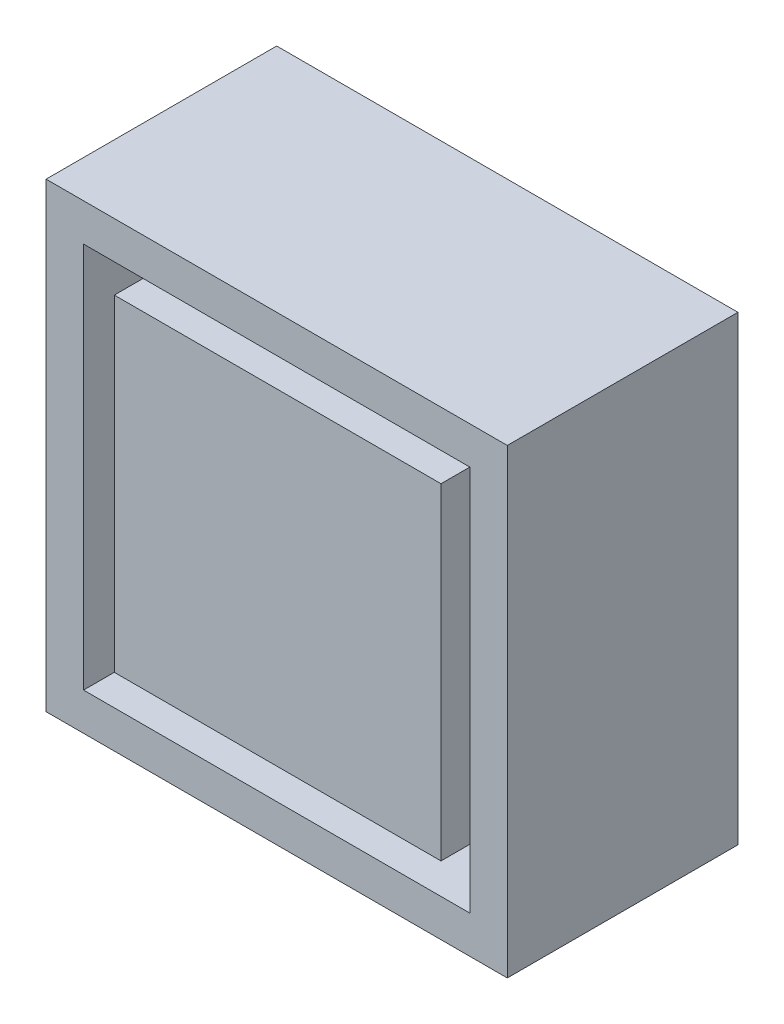
ISO-10303-21;
HEADER;
FILE_DESCRIPTION(('STEP AP214'),'2;1');
FILE_NAME('part.step','',(''),(''),'','','');
FILE_SCHEMA(('AUTOMOTIVE_DESIGN { 1 0 10303 214 1 1 1 1 }'));
ENDSEC;
DATA;
#1=APPLICATION_CONTEXT('core data for automotive mechanical design processes');
#2=APPLICATION_PROTOCOL_DEFINITION('international standard','automotive_design',2000,#1);
#3=PRODUCT_CONTEXT('',#1,'mechanical');
#4=PRODUCT('Part','Part','',(#3));
#5=PRODUCT_RELATED_PRODUCT_CATEGORY('part','',(#4));
#6=PRODUCT_DEFINITION_FORMATION('','',#4);
#7=PRODUCT_DEFINITION_CONTEXT('part definition',#1,'design');
#8=PRODUCT_DEFINITION('design','',#6,#7);
#9=PRODUCT_DEFINITION_SHAPE('','',#8);
#10=(LENGTH_UNIT() NAMED_UNIT(*) SI_UNIT(.MILLI.,.METRE.));
#11=(NAMED_UNIT(*) PLANE_ANGLE_UNIT() SI_UNIT($,.RADIAN.));
#12=(NAMED_UNIT(*) SI_UNIT($,.STERADIAN.) SOLID_ANGLE_UNIT());
#13=UNCERTAINTY_MEASURE_WITH_UNIT(LENGTH_MEASURE(1.E-05),#10,'distance_accuracy_value','');
#14=(GEOMETRIC_REPRESENTATION_CONTEXT(3) GLOBAL_UNCERTAINTY_ASSIGNED_CONTEXT((#13)) GLOBAL_UNIT_ASSIGNED_CONTEXT((#10,
#11,#12)) REPRESENTATION_CONTEXT('',''));
#15=CARTESIAN_POINT('',(0.,0.,0.));
#16=DIRECTION('',(0.,0.,1.));
#17=DIRECTION('',(1.,0.,0.));
#18=AXIS2_PLACEMENT_3D('',#15,#16,#17);
#19=CARTESIAN_POINT('',(0.,0.,1.95));
#20=DIRECTION('',(0.,0.,-1.));
#21=DIRECTION('',(-1.,0.,0.));
#22=AXIS2_PLACEMENT_3D('',#19,#20,#21);
#23=PLANE('',#22);
#24=DIRECTION('',(0.,-1.,0.));
#25=VECTOR('',#24,1.);
#26=CARTESIAN_POINT('',(1.95,0.,1.95));
#27=LINE('',#26,#25);
#28=CARTESIAN_POINT('',(1.95,22.05,1.95));
#29=VERTEX_POINT('',#28);
#30=CARTESIAN_POINT('',(1.95,1.95,1.95));
#31=VERTEX_POINT('',#30);
#32=EDGE_CURVE('E145',#29,#31,#27,.T.);
#33=ORIENTED_EDGE('',*,*,#32,.T.);
#34=DIRECTION('',(1.,0.,0.));
#35=VECTOR('',#34,1.);
#36=CARTESIAN_POINT('',(0.,1.95,1.95));
#37=LINE('',#36,#35);
#38=CARTESIAN_POINT('',(22.05,1.95,1.95));
#39=VERTEX_POINT('',#38);
#40=EDGE_CURVE('E148',#31,#39,#37,.T.);
#41=ORIENTED_EDGE('',*,*,#40,.T.);
#42=DIRECTION('',(0.,1.,0.));
#43=VECTOR('',#42,1.);
#44=CARTESIAN_POINT('',(22.05,0.,1.95));
#45=LINE('',#44,#43);
#46=CARTESIAN_POINT('',(22.05,22.05,1.95));
#47=VERTEX_POINT('',#46);
#48=EDGE_CURVE('E165',#39,#47,#45,.T.);
#49=ORIENTED_EDGE('',*,*,#48,.T.);
#50=DIRECTION('',(-1.,0.,0.));
#51=VECTOR('',#50,1.);
#52=CARTESIAN_POINT('',(0.,22.05,1.95));
#53=LINE('',#52,#51);
#54=EDGE_CURVE('E169',#47,#29,#53,.T.);
#55=ORIENTED_EDGE('',*,*,#54,.T.);
#56=EDGE_LOOP('',(#33,#41,#49,#55));
#57=FACE_BOUND('',#56,.T.);
#58=DIRECTION('',(0.,-1.,0.));
#59=VECTOR('',#58,1.);
#60=CARTESIAN_POINT('',(3.5,20.5,1.95));
#61=LINE('',#60,#59);
#62=CARTESIAN_POINT('',(3.5,20.5,1.95));
#63=VERTEX_POINT('',#62);
#64=CARTESIAN_POINT('',(3.5,3.5,1.95));
#65=VERTEX_POINT('',#64);
#66=EDGE_CURVE('E144',#63,#65,#61,.T.);
#67=ORIENTED_EDGE('',*,*,#66,.F.);
#68=DIRECTION('',(-1.,0.,0.));
#69=VECTOR('',#68,1.);
#70=CARTESIAN_POINT('',(3.5,20.5,1.95));
#71=LINE('',#70,#69);
#72=CARTESIAN_POINT('',(20.5,20.5,1.95));
#73=VERTEX_POINT('',#72);
#74=EDGE_CURVE('E141',#73,#63,#71,.T.);
#75=ORIENTED_EDGE('',*,*,#74,.F.);
#76=DIRECTION('',(0.,1.,0.));
#77=VECTOR('',#76,1.);
#78=CARTESIAN_POINT('',(20.5,20.5,1.95));
#79=LINE('',#78,#77);
#80=CARTESIAN_POINT('',(20.5,3.5,1.95));
#81=VERTEX_POINT('',#80);
#82=EDGE_CURVE('E55',#81,#73,#79,.T.);
#83=ORIENTED_EDGE('',*,*,#82,.F.);
#84=DIRECTION('',(1.,0.,0.));
#85=VECTOR('',#84,1.);
#86=CARTESIAN_POINT('',(3.5,3.5,1.95));
#87=LINE('',#86,#85);
#88=EDGE_CURVE('E50',#65,#81,#87,.T.);
#89=ORIENTED_EDGE('',*,*,#88,.F.);
#90=EDGE_LOOP('',(#67,#75,#83,#89));
#91=FACE_BOUND('',#90,.T.);
#92=ADVANCED_FACE('F35',(#57,#91),#23,.F.);
#93=CARTESIAN_POINT('',(0.,0.,12.));
#94=DIRECTION('',(0.,0.,-1.));
#95=DIRECTION('',(-1.,0.,0.));
#96=AXIS2_PLACEMENT_3D('',#93,#94,#95);
#97=PLANE('',#96);
#98=DIRECTION('',(0.,-1.,0.));
#99=VECTOR('',#98,1.);
#100=CARTESIAN_POINT('',(0.,0.,12.));
#101=LINE('',#100,#99);
#102=CARTESIAN_POINT('',(0.,24.,12.));
#103=VERTEX_POINT('',#102);
#104=CARTESIAN_POINT('',(0.,0.,12.));
#105=VERTEX_POINT('',#104);
#106=EDGE_CURVE('E181',#103,#105,#101,.T.);
#107=ORIENTED_EDGE('',*,*,#106,.T.);
#108=DIRECTION('',(1.,0.,0.));
#109=VECTOR('',#108,1.);
#110=CARTESIAN_POINT('',(0.,0.,12.));
#111=LINE('',#110,#109);
#112=CARTESIAN_POINT('',(24.,0.,12.));
#113=VERTEX_POINT('',#112);
#114=EDGE_CURVE('E184',#105,#113,#111,.T.);
#115=ORIENTED_EDGE('',*,*,#114,.T.);
#116=DIRECTION('',(0.,1.,0.));
#117=VECTOR('',#116,1.);
#118=CARTESIAN_POINT('',(24.,0.,12.));
#119=LINE('',#118,#117);
#120=CARTESIAN_POINT('',(24.,24.,12.));
#121=VERTEX_POINT('',#120);
#122=EDGE_CURVE('E187',#113,#121,#119,.T.);
#123=ORIENTED_EDGE('',*,*,#122,.T.);
#124=DIRECTION('',(-1.,0.,0.));
#125=VECTOR('',#124,1.);
#126=CARTESIAN_POINT('',(0.,24.,12.));
#127=LINE('',#126,#125);
#128=EDGE_CURVE('E189',#121,#103,#127,.T.);
#129=ORIENTED_EDGE('',*,*,#128,.T.);
#130=EDGE_LOOP('',(#107,#115,#123,#129));
#131=FACE_BOUND('',#130,.T.);
#132=DIRECTION('',(0.,-1.,0.));
#133=VECTOR('',#132,1.);
#134=CARTESIAN_POINT('',(1.95,0.,12.));
#135=LINE('',#134,#133);
#136=CARTESIAN_POINT('',(1.95,22.05,12.));
#137=VERTEX_POINT('',#136);
#138=CARTESIAN_POINT('',(1.95,1.95,12.));
#139=VERTEX_POINT('',#138);
#140=EDGE_CURVE('E173',#137,#139,#135,.T.);
#141=ORIENTED_EDGE('',*,*,#140,.F.);
#142=DIRECTION('',(-1.,0.,0.));
#143=VECTOR('',#142,1.);
#144=CARTESIAN_POINT('',(0.,22.05,12.));
#145=LINE('',#144,#143);
#146=CARTESIAN_POINT('',(22.05,22.05,12.));
#147=VERTEX_POINT('',#146);
#148=EDGE_CURVE('E163',#147,#137,#145,.T.);
#149=ORIENTED_EDGE('',*,*,#148,.F.);
#150=DIRECTION('',(0.,1.,0.));
#151=VECTOR('',#150,1.);
#152=CARTESIAN_POINT('',(22.05,0.,12.));
#153=LINE('',#152,#151);
#154=CARTESIAN_POINT('',(22.05,1.95,12.));
#155=VERTEX_POINT('',#154);
#156=EDGE_CURVE('E177',#155,#147,#153,.T.);
#157=ORIENTED_EDGE('',*,*,#156,.F.);
#158=DIRECTION('',(1.,0.,0.));
#159=VECTOR('',#158,1.);
#160=CARTESIAN_POINT('',(0.,1.95,12.));
#161=LINE('',#160,#159);
#162=EDGE_CURVE('E175',#139,#155,#161,.T.);
#163=ORIENTED_EDGE('',*,*,#162,.F.);
#164=EDGE_LOOP('',(#141,#149,#157,#163));
#165=FACE_BOUND('',#164,.T.);
#166=ADVANCED_FACE('F223',(#131,#165),#97,.F.);
#167=CARTESIAN_POINT('',(0.,0.,12.));
#168=DIRECTION('',(1.,0.,0.));
#169=DIRECTION('',(0.,1.,0.));
#170=AXIS2_PLACEMENT_3D('',#167,#168,#169);
#171=PLANE('',#170);
#172=DIRECTION('',(0.,-1.,0.));
#173=VECTOR('',#172,1.);
#174=CARTESIAN_POINT('',(0.,0.,0.));
#175=LINE('',#174,#173);
#176=CARTESIAN_POINT('',(0.,24.,0.));
#177=VERTEX_POINT('',#176);
#178=CARTESIAN_POINT('',(0.,0.,0.));
#179=VERTEX_POINT('',#178);
#180=EDGE_CURVE('E157',#177,#179,#175,.T.);
#181=ORIENTED_EDGE('',*,*,#180,.T.);
#182=DIRECTION('',(0.,0.,-1.));
#183=VECTOR('',#182,1.);
#184=CARTESIAN_POINT('',(0.,0.,12.));
#185=LINE('',#184,#183);
#186=EDGE_CURVE('E11',#105,#179,#185,.T.);
#187=ORIENTED_EDGE('',*,*,#186,.F.);
#188=ORIENTED_EDGE('',*,*,#106,.F.);
#189=DIRECTION('',(0.,0.,-1.));
#190=VECTOR('',#189,1.);
#191=CARTESIAN_POINT('',(0.,24.,12.));
#192=LINE('',#191,#190);
#193=EDGE_CURVE('E191',#103,#177,#192,.T.);
#194=ORIENTED_EDGE('',*,*,#193,.T.);
#195=EDGE_LOOP('',(#181,#187,#188,#194));
#196=FACE_BOUND('',#195,.T.);
#197=ADVANCED_FACE('F37',(#196),#171,.F.);
#198=CARTESIAN_POINT('',(0.,0.,12.));
#199=DIRECTION('',(0.,1.,0.));
#200=DIRECTION('',(0.,0.,1.));
#201=AXIS2_PLACEMENT_3D('',#198,#199,#200);
#202=PLANE('',#201);
#203=DIRECTION('',(1.,0.,0.));
#204=VECTOR('',#203,1.);
#205=CARTESIAN_POINT('',(0.,0.,0.));
#206=LINE('',#205,#204);
#207=CARTESIAN_POINT('',(24.,0.,0.));
#208=VERTEX_POINT('',#207);
#209=EDGE_CURVE('E194',#179,#208,#206,.T.);
#210=ORIENTED_EDGE('',*,*,#209,.T.);
#211=DIRECTION('',(0.,0.,-1.));
#212=VECTOR('',#211,1.);
#213=CARTESIAN_POINT('',(24.,0.,12.));
#214=LINE('',#213,#212);
#215=EDGE_CURVE('E43',#113,#208,#214,.T.);
#216=ORIENTED_EDGE('',*,*,#215,.F.);
#217=ORIENTED_EDGE('',*,*,#114,.F.);
#218=ORIENTED_EDGE('',*,*,#186,.T.);
#219=EDGE_LOOP('',(#210,#216,#217,#218));
#220=FACE_BOUND('',#219,.T.);
#221=ADVANCED_FACE('F225',(#220),#202,.F.);
#222=CARTESIAN_POINT('',(24.,0.,12.));
#223=DIRECTION('',(-1.,0.,0.));
#224=DIRECTION('',(0.,0.,1.));
#225=AXIS2_PLACEMENT_3D('',#222,#223,#224);
#226=PLANE('',#225);
#227=DIRECTION('',(0.,1.,0.));
#228=VECTOR('',#227,1.);
#229=CARTESIAN_POINT('',(24.,0.,0.));
#230=LINE('',#229,#228);
#231=CARTESIAN_POINT('',(24.,24.,0.));
#232=VERTEX_POINT('',#231);
#233=EDGE_CURVE('E196',#208,#232,#230,.T.);
#234=ORIENTED_EDGE('',*,*,#233,.T.);
#235=DIRECTION('',(0.,0.,-1.));
#236=VECTOR('',#235,1.);
#237=CARTESIAN_POINT('',(24.,24.,12.));
#238=LINE('',#237,#236);
#239=EDGE_CURVE('E201',#121,#232,#238,.T.);
#240=ORIENTED_EDGE('',*,*,#239,.F.);
#241=ORIENTED_EDGE('',*,*,#122,.F.);
#242=ORIENTED_EDGE('',*,*,#215,.T.);
#243=EDGE_LOOP('',(#234,#240,#241,#242));
#244=FACE_BOUND('',#243,.T.);
#245=ADVANCED_FACE('F208',(#244),#226,.F.);
#246=CARTESIAN_POINT('',(0.,24.,12.));
#247=DIRECTION('',(0.,-1.,0.));
#248=DIRECTION('',(0.,0.,-1.));
#249=AXIS2_PLACEMENT_3D('',#246,#247,#248);
#250=PLANE('',#249);
#251=DIRECTION('',(-1.,0.,0.));
#252=VECTOR('',#251,1.);
#253=CARTESIAN_POINT('',(0.,24.,0.));
#254=LINE('',#253,#252);
#255=EDGE_CURVE('E185',#232,#177,#254,.T.);
#256=ORIENTED_EDGE('',*,*,#255,.T.);
#257=ORIENTED_EDGE('',*,*,#193,.F.);
#258=ORIENTED_EDGE('',*,*,#128,.F.);
#259=ORIENTED_EDGE('',*,*,#239,.T.);
#260=EDGE_LOOP('',(#256,#257,#258,#259));
#261=FACE_BOUND('',#260,.T.);
#262=ADVANCED_FACE('F217',(#261),#250,.F.);
#263=CARTESIAN_POINT('',(0.,0.,0.));
#264=DIRECTION('',(0.,0.,-1.));
#265=DIRECTION('',(-1.,0.,0.));
#266=AXIS2_PLACEMENT_3D('',#263,#264,#265);
#267=PLANE('',#266);
#268=ORIENTED_EDGE('',*,*,#180,.F.);
#269=ORIENTED_EDGE('',*,*,#255,.F.);
#270=ORIENTED_EDGE('',*,*,#233,.F.);
#271=ORIENTED_EDGE('',*,*,#209,.F.);
#272=EDGE_LOOP('',(#268,#269,#270,#271));
#273=FACE_BOUND('',#272,.T.);
#274=ADVANCED_FACE('F214',(#273),#267,.T.);
#275=CARTESIAN_POINT('',(1.95,0.,12.));
#276=DIRECTION('',(1.,0.,0.));
#277=DIRECTION('',(0.,1.,0.));
#278=AXIS2_PLACEMENT_3D('',#275,#276,#277);
#279=PLANE('',#278);
#280=ORIENTED_EDGE('',*,*,#32,.F.);
#281=DIRECTION('',(0.,0.,-1.));
#282=VECTOR('',#281,1.);
#283=CARTESIAN_POINT('',(1.95,22.05,12.));
#284=LINE('',#283,#282);
#285=EDGE_CURVE('E159',#137,#29,#284,.T.);
#286=ORIENTED_EDGE('',*,*,#285,.F.);
#287=ORIENTED_EDGE('',*,*,#140,.T.);
#288=DIRECTION('',(0.,0.,-1.));
#289=VECTOR('',#288,1.);
#290=CARTESIAN_POINT('',(1.95,1.95,12.));
#291=LINE('',#290,#289);
#292=EDGE_CURVE('E154',#139,#31,#291,.T.);
#293=ORIENTED_EDGE('',*,*,#292,.T.);
#294=EDGE_LOOP('',(#280,#286,#287,#293));
#295=FACE_BOUND('',#294,.T.);
#296=ADVANCED_FACE('F245',(#295),#279,.T.);
#297=CARTESIAN_POINT('',(0.,1.95,12.));
#298=DIRECTION('',(0.,1.,0.));
#299=DIRECTION('',(0.,0.,1.));
#300=AXIS2_PLACEMENT_3D('',#297,#298,#299);
#301=PLANE('',#300);
#302=ORIENTED_EDGE('',*,*,#40,.F.);
#303=ORIENTED_EDGE('',*,*,#292,.F.);
#304=ORIENTED_EDGE('',*,*,#162,.T.);
#305=DIRECTION('',(0.,0.,-1.));
#306=VECTOR('',#305,1.);
#307=CARTESIAN_POINT('',(22.05,1.95,12.));
#308=LINE('',#307,#306);
#309=EDGE_CURVE('E158',#155,#39,#308,.T.);
#310=ORIENTED_EDGE('',*,*,#309,.T.);
#311=EDGE_LOOP('',(#302,#303,#304,#310));
#312=FACE_BOUND('',#311,.T.);
#313=ADVANCED_FACE('F262',(#312),#301,.T.);
#314=CARTESIAN_POINT('',(22.05,0.,12.));
#315=DIRECTION('',(-1.,0.,0.));
#316=DIRECTION('',(0.,0.,1.));
#317=AXIS2_PLACEMENT_3D('',#314,#315,#316);
#318=PLANE('',#317);
#319=ORIENTED_EDGE('',*,*,#48,.F.);
#320=ORIENTED_EDGE('',*,*,#309,.F.);
#321=ORIENTED_EDGE('',*,*,#156,.T.);
#322=DIRECTION('',(0.,0.,-1.));
#323=VECTOR('',#322,1.);
#324=CARTESIAN_POINT('',(22.05,22.05,12.));
#325=LINE('',#324,#323);
#326=EDGE_CURVE('E162',#147,#47,#325,.T.);
#327=ORIENTED_EDGE('',*,*,#326,.T.);
#328=EDGE_LOOP('',(#319,#320,#321,#327));
#329=FACE_BOUND('',#328,.T.);
#330=ADVANCED_FACE('F270',(#329),#318,.T.);
#331=CARTESIAN_POINT('',(0.,22.05,12.));
#332=DIRECTION('',(0.,-1.,0.));
#333=DIRECTION('',(0.,0.,-1.));
#334=AXIS2_PLACEMENT_3D('',#331,#332,#333);
#335=PLANE('',#334);
#336=ORIENTED_EDGE('',*,*,#54,.F.);
#337=ORIENTED_EDGE('',*,*,#326,.F.);
#338=ORIENTED_EDGE('',*,*,#148,.T.);
#339=ORIENTED_EDGE('',*,*,#285,.T.);
#340=EDGE_LOOP('',(#336,#337,#338,#339));
#341=FACE_BOUND('',#340,.T.);
#342=ADVANCED_FACE('F240',(#341),#335,.T.);
#343=CARTESIAN_POINT('',(3.5,20.5,11.95));
#344=DIRECTION('',(1.,0.,0.));
#345=DIRECTION('',(0.,1.,0.));
#346=AXIS2_PLACEMENT_3D('',#343,#344,#345);
#347=PLANE('',#346);
#348=ORIENTED_EDGE('',*,*,#66,.T.);
#349=DIRECTION('',(0.,0.,-1.));
#350=VECTOR('',#349,1.);
#351=CARTESIAN_POINT('',(3.5,3.5,11.95));
#352=LINE('',#351,#350);
#353=CARTESIAN_POINT('',(3.5,3.5,11.95));
#354=VERTEX_POINT('',#353);
#355=EDGE_CURVE('E125',#354,#65,#352,.T.);
#356=ORIENTED_EDGE('',*,*,#355,.F.);
#357=DIRECTION('',(0.,-1.,0.));
#358=VECTOR('',#357,1.);
#359=CARTESIAN_POINT('',(3.5,20.5,11.95));
#360=LINE('',#359,#358);
#361=CARTESIAN_POINT('',(3.5,20.5,11.95));
#362=VERTEX_POINT('',#361);
#363=EDGE_CURVE('E132',#362,#354,#360,.T.);
#364=ORIENTED_EDGE('',*,*,#363,.F.);
#365=DIRECTION('',(0.,0.,-1.));
#366=VECTOR('',#365,1.);
#367=CARTESIAN_POINT('',(3.5,20.5,11.95));
#368=LINE('',#367,#366);
#369=EDGE_CURVE('E367',#362,#63,#368,.T.);
#370=ORIENTED_EDGE('',*,*,#369,.T.);
#371=EDGE_LOOP('',(#348,#356,#364,#370));
#372=FACE_BOUND('',#371,.T.);
#373=ADVANCED_FACE('F143',(#372),#347,.F.);
#374=CARTESIAN_POINT('',(3.5,3.5,11.95));
#375=DIRECTION('',(0.,1.,0.));
#376=DIRECTION('',(0.,0.,1.));
#377=AXIS2_PLACEMENT_3D('',#374,#375,#376);
#378=PLANE('',#377);
#379=ORIENTED_EDGE('',*,*,#88,.T.);
#380=DIRECTION('',(0.,0.,-1.));
#381=VECTOR('',#380,1.);
#382=CARTESIAN_POINT('',(20.5,3.5,11.95));
#383=LINE('',#382,#381);
#384=CARTESIAN_POINT('',(20.5,3.5,11.95));
#385=VERTEX_POINT('',#384);
#386=EDGE_CURVE('E128',#385,#81,#383,.T.);
#387=ORIENTED_EDGE('',*,*,#386,.F.);
#388=DIRECTION('',(1.,0.,0.));
#389=VECTOR('',#388,1.);
#390=CARTESIAN_POINT('',(3.5,3.5,11.95));
#391=LINE('',#390,#389);
#392=EDGE_CURVE('E121',#354,#385,#391,.T.);
#393=ORIENTED_EDGE('',*,*,#392,.F.);
#394=ORIENTED_EDGE('',*,*,#355,.T.);
#395=EDGE_LOOP('',(#379,#387,#393,#394));
#396=FACE_BOUND('',#395,.T.);
#397=ADVANCED_FACE('F123',(#396),#378,.F.);
#398=CARTESIAN_POINT('',(20.5,20.5,11.95));
#399=DIRECTION('',(-1.,0.,0.));
#400=DIRECTION('',(0.,-1.,0.));
#401=AXIS2_PLACEMENT_3D('',#398,#399,#400);
#402=PLANE('',#401);
#403=ORIENTED_EDGE('',*,*,#82,.T.);
#404=DIRECTION('',(0.,0.,-1.));
#405=VECTOR('',#404,1.);
#406=CARTESIAN_POINT('',(20.5,20.5,11.95));
#407=LINE('',#406,#405);
#408=CARTESIAN_POINT('',(20.5,20.5,11.95));
#409=VERTEX_POINT('',#408);
#410=EDGE_CURVE('E150',#409,#73,#407,.T.);
#411=ORIENTED_EDGE('',*,*,#410,.F.);
#412=DIRECTION('',(0.,1.,0.));
#413=VECTOR('',#412,1.);
#414=CARTESIAN_POINT('',(20.5,20.5,11.95));
#415=LINE('',#414,#413);
#416=EDGE_CURVE('E131',#385,#409,#415,.T.);
#417=ORIENTED_EDGE('',*,*,#416,.F.);
#418=ORIENTED_EDGE('',*,*,#386,.T.);
#419=EDGE_LOOP('',(#403,#411,#417,#418));
#420=FACE_BOUND('',#419,.T.);
#421=ADVANCED_FACE('F296',(#420),#402,.F.);
#422=CARTESIAN_POINT('',(3.5,20.5,11.95));
#423=DIRECTION('',(0.,-1.,0.));
#424=DIRECTION('',(0.,0.,-1.));
#425=AXIS2_PLACEMENT_3D('',#422,#423,#424);
#426=PLANE('',#425);
#427=ORIENTED_EDGE('',*,*,#74,.T.);
#428=ORIENTED_EDGE('',*,*,#369,.F.);
#429=DIRECTION('',(-1.,0.,0.));
#430=VECTOR('',#429,1.);
#431=CARTESIAN_POINT('',(3.5,20.5,11.95));
#432=LINE('',#431,#430);
#433=EDGE_CURVE('E137',#409,#362,#432,.T.);
#434=ORIENTED_EDGE('',*,*,#433,.F.);
#435=ORIENTED_EDGE('',*,*,#410,.T.);
#436=EDGE_LOOP('',(#427,#428,#434,#435));
#437=FACE_BOUND('',#436,.T.);
#438=ADVANCED_FACE('F303',(#437),#426,.F.);
#439=CARTESIAN_POINT('',(0.,0.,11.95));
#440=DIRECTION('',(0.,0.,1.));
#441=DIRECTION('',(1.,0.,0.));
#442=AXIS2_PLACEMENT_3D('',#439,#440,#441);
#443=PLANE('',#442);
#444=ORIENTED_EDGE('',*,*,#363,.T.);
#445=ORIENTED_EDGE('',*,*,#392,.T.);
#446=ORIENTED_EDGE('',*,*,#416,.T.);
#447=ORIENTED_EDGE('',*,*,#433,.T.);
#448=EDGE_LOOP('',(#444,#445,#446,#447));
#449=FACE_BOUND('',#448,.T.);
#450=ADVANCED_FACE('F135',(#449),#443,.T.);
#451=CLOSED_SHELL('',(#92,#166,#197,#221,#245,#262,#274,#296,#313,#330,#342,#373,#397,#421,#438,#450));
#452=MANIFOLD_SOLID_BREP('B2',#451);
#453=ADVANCED_BREP_SHAPE_REPRESENTATION('',(#18,#452),#14);
#454=SHAPE_DEFINITION_REPRESENTATION(#9,#453);
ENDSEC;
END-ISO-10303-21;
